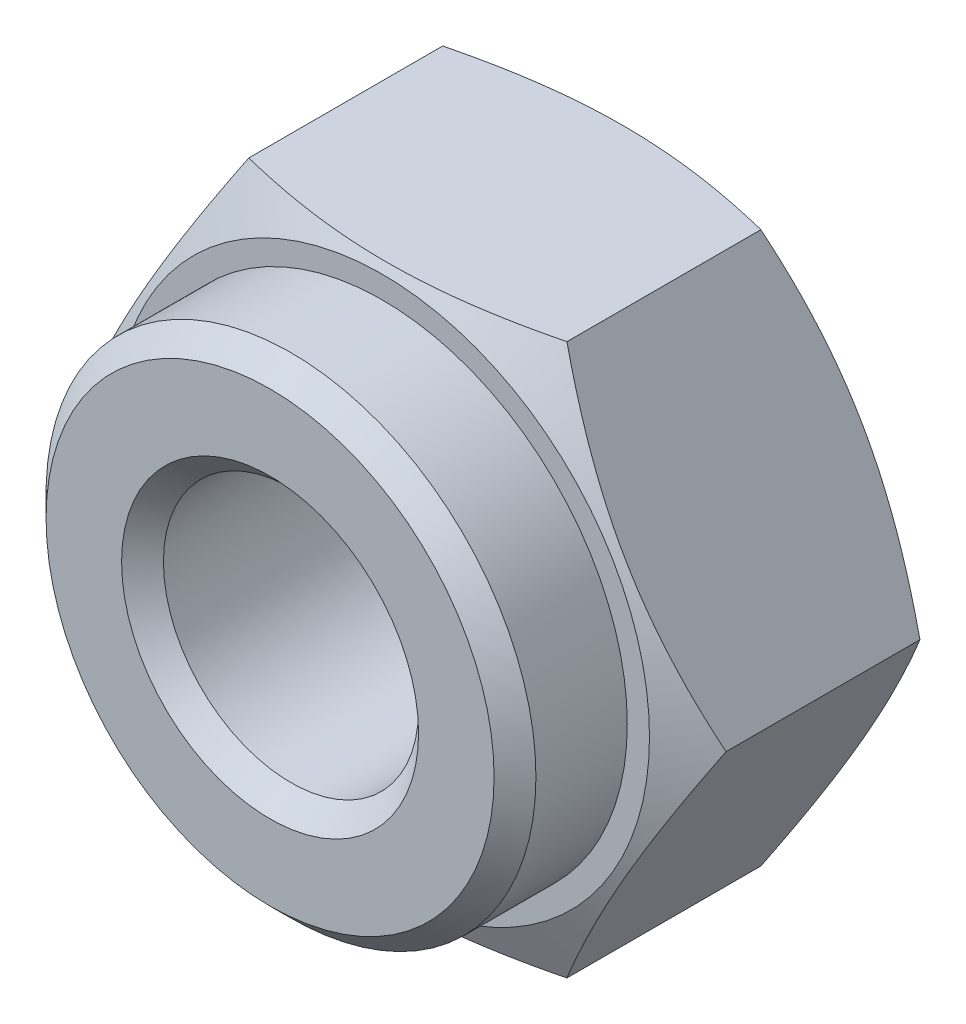
ISO-10303-21;
HEADER;
FILE_DESCRIPTION(('STEP AP214'),'2;1');
FILE_NAME('part.step','',(''),(''),'','','');
FILE_SCHEMA(('AUTOMOTIVE_DESIGN { 1 0 10303 214 1 1 1 1 }'));
ENDSEC;
DATA;
#1=APPLICATION_CONTEXT('core data for automotive mechanical design processes');
#2=APPLICATION_PROTOCOL_DEFINITION('international standard','automotive_design',2000,#1);
#3=PRODUCT_CONTEXT('',#1,'mechanical');
#4=PRODUCT('Part','Part','',(#3));
#5=PRODUCT_RELATED_PRODUCT_CATEGORY('part','',(#4));
#6=PRODUCT_DEFINITION_FORMATION('','',#4);
#7=PRODUCT_DEFINITION_CONTEXT('part definition',#1,'design');
#8=PRODUCT_DEFINITION('design','',#6,#7);
#9=PRODUCT_DEFINITION_SHAPE('','',#8);
#10=(LENGTH_UNIT() NAMED_UNIT(*) SI_UNIT(.MILLI.,.METRE.));
#11=(NAMED_UNIT(*) PLANE_ANGLE_UNIT() SI_UNIT($,.RADIAN.));
#12=(NAMED_UNIT(*) SI_UNIT($,.STERADIAN.) SOLID_ANGLE_UNIT());
#13=UNCERTAINTY_MEASURE_WITH_UNIT(LENGTH_MEASURE(1.E-05),#10,'distance_accuracy_value','');
#14=(GEOMETRIC_REPRESENTATION_CONTEXT(3) GLOBAL_UNCERTAINTY_ASSIGNED_CONTEXT((#13)) GLOBAL_UNIT_ASSIGNED_CONTEXT((#10,
#11,#12)) REPRESENTATION_CONTEXT('',''));
#15=CARTESIAN_POINT('',(0.,0.,0.));
#16=DIRECTION('',(0.,0.,1.));
#17=DIRECTION('',(1.,0.,0.));
#18=AXIS2_PLACEMENT_3D('',#15,#16,#17);
#19=CARTESIAN_POINT('',(0.,0.,2.4));
#20=DIRECTION('',(0.,0.,1.));
#21=DIRECTION('',(1.,0.,0.));
#22=AXIS2_PLACEMENT_3D('',#19,#20,#21);
#23=PLANE('',#22);
#24=CARTESIAN_POINT('',(0.,0.,2.39999999999996));
#25=DIRECTION('',(0.,0.,1.));
#26=DIRECTION('',(1.,0.,0.));
#27=AXIS2_PLACEMENT_3D('',#24,#25,#26);
#28=CIRCLE('',#27,2.61769145362398);
#29=CARTESIAN_POINT('',(2.61769145362398,0.,2.39999999999995));
#30=VERTEX_POINT('',#29);
#31=EDGE_CURVE('E212',#30,#30,#28,.T.);
#32=ORIENTED_EDGE('',*,*,#31,.T.);
#33=EDGE_LOOP('',(#32));
#34=FACE_BOUND('',#33,.T.);
#35=CARTESIAN_POINT('',(0.,0.,2.4));
#36=DIRECTION('',(0.,0.,1.));
#37=DIRECTION('',(1.,0.,0.));
#38=AXIS2_PLACEMENT_3D('',#35,#36,#37);
#39=CIRCLE('',#38,2.4);
#40=CARTESIAN_POINT('',(2.4,0.,2.4));
#41=VERTEX_POINT('',#40);
#42=EDGE_CURVE('E248',#41,#41,#39,.T.);
#43=ORIENTED_EDGE('',*,*,#42,.F.);
#44=EDGE_LOOP('',(#43));
#45=FACE_BOUND('',#44,.T.);
#46=ADVANCED_FACE('F17',(#34,#45),#23,.T.);
#47=CARTESIAN_POINT('',(0.,0.,0.));
#48=DIRECTION('',(0.,0.,1.));
#49=DIRECTION('',(1.,0.,0.));
#50=AXIS2_PLACEMENT_3D('',#47,#48,#49);
#51=PLANE('',#50);
#52=CARTESIAN_POINT('',(0.,0.,0.));
#53=DIRECTION('',(0.,0.,1.));
#54=DIRECTION('',(1.,0.,0.));
#55=AXIS2_PLACEMENT_3D('',#52,#53,#54);
#56=CIRCLE('',#55,1.455);
#57=CARTESIAN_POINT('',(1.455,0.,0.));
#58=VERTEX_POINT('',#57);
#59=EDGE_CURVE('E90',#58,#58,#56,.T.);
#60=ORIENTED_EDGE('',*,*,#59,.T.);
#61=EDGE_LOOP('',(#60));
#62=FACE_BOUND('',#61,.T.);
#63=CARTESIAN_POINT('',(0.,0.,0.));
#64=DIRECTION('',(0.,0.,1.));
#65=DIRECTION('',(1.,0.,0.));
#66=AXIS2_PLACEMENT_3D('',#63,#64,#65);
#67=CIRCLE('',#66,2.61769145362398);
#68=CARTESIAN_POINT('',(2.61769145362398,0.,0.));
#69=VERTEX_POINT('',#68);
#70=EDGE_CURVE('E76',#69,#69,#67,.T.);
#71=ORIENTED_EDGE('',*,*,#70,.F.);
#72=EDGE_LOOP('',(#71));
#73=FACE_BOUND('',#72,.T.);
#74=ADVANCED_FACE('F238',(#62,#73),#51,.F.);
#75=CARTESIAN_POINT('',(1.55884572681202,-2.7,2.4));
#76=DIRECTION('',(-0.866025403784442,0.5,0.));
#77=DIRECTION('',(-0.5,-0.866025403784442,0.));
#78=AXIS2_PLACEMENT_3D('',#75,#76,#77);
#79=PLANE('',#78);
#80=DIRECTION('',(0.,0.,-1.));
#81=VECTOR('',#80,1.);
#82=CARTESIAN_POINT('',(3.11769145362398,0.,2.4));
#83=LINE('',#82,#81);
#84=CARTESIAN_POINT('',(3.11769145362398,0.,2.14999999999998));
#85=VERTEX_POINT('',#84);
#86=CARTESIAN_POINT('',(3.11769145362398,0.,0.249999999999962));
#87=VERTEX_POINT('',#86);
#88=EDGE_CURVE('E85',#85,#87,#83,.T.);
#89=ORIENTED_EDGE('',*,*,#88,.F.);
#90=CARTESIAN_POINT('',(3.11780692367782,0.0002,2.14994226176567));
#91=CARTESIAN_POINT('',(3.07386192732842,-0.0759149664156107,2.17190865811727));
#92=CARTESIAN_POINT('',(3.02975666307042,-0.152307524991735,2.19257633708538));
#93=CARTESIAN_POINT('',(2.94119479165017,-0.305701185904994,2.23086925118443));
#94=CARTESIAN_POINT('',(2.89673801578346,-0.382702580446841,2.24849291937494));
#95=CARTESIAN_POINT('',(2.762759000059,-0.61476104282966,2.29613418161974));
#96=CARTESIAN_POINT('',(2.67272961448054,-0.770696512825772,2.32086913954805));
#97=CARTESIAN_POINT('',(2.53815325962149,-1.00378959693907,2.34482575675592));
#98=CARTESIAN_POINT('',(2.49388344587926,-1.08046716358222,2.35062594437673));
#99=CARTESIAN_POINT('',(2.4052569587881,-1.23397274212046,2.35790471774251));
#100=CARTESIAN_POINT('',(2.36090029805457,-1.31080073216503,2.35938389040537));
#101=CARTESIAN_POINT('',(2.27224935901895,-1.46434866271341,2.35795897875804));
#102=CARTESIAN_POINT('',(2.22795506231461,-1.54106863509086,2.35505921200905));
#103=CARTESIAN_POINT('',(2.13949248077105,-1.694290320893,2.34499790198758));
#104=CARTESIAN_POINT('',(2.09532418551242,-1.77079205236464,2.33783672200987));
#105=CARTESIAN_POINT('',(2.00996355172353,-1.91864100705328,2.32008684762));
#106=CARTESIAN_POINT('',(1.96875838024961,-1.99001045758072,2.30974141539699));
#107=CARTESIAN_POINT('',(1.88657953411541,-2.13234839439254,2.28582880871383));
#108=CARTESIAN_POINT('',(1.84560588467828,-2.20331683698917,2.2722612898974));
#109=CARTESIAN_POINT('',(1.76347074406329,-2.34557907362115,2.24207489271815));
#110=CARTESIAN_POINT('',(1.72231225533246,-2.41686766726569,2.225423667329));
#111=CARTESIAN_POINT('',(1.64029736310983,-2.55892162757258,2.18953475849402));
#112=CARTESIAN_POINT('',(1.59944082764135,-2.62968722282523,2.17029828536225));
#113=CARTESIAN_POINT('',(1.55873025675818,-2.7002,2.14994226176568));
#114=B_SPLINE_CURVE_WITH_KNOTS('',3,(#90,#91,#92,#93,#94,#95,#96,#97,#98,#99,#100,#101,#102,
#103,#104,#105,#106,#107,#108,#109,#110,#111,#112,#113),.UNSPECIFIED.,.F.,.F.,(4,2,2,2,2,2,2,2,
2,2,2,4),(0.,0.271754269824136,0.543648014133352,1.08806367663849,1.35416472324904,
1.62022962401707,1.88603236046234,2.15181243989058,2.40091555257944,2.65004529982691,
2.90195385117269,3.15374487675168),.UNSPECIFIED.);
#115=CARTESIAN_POINT('',(1.55884572681202,-2.7,2.15));
#116=VERTEX_POINT('',#115);
#117=EDGE_CURVE('E68',#85,#116,#114,.T.);
#118=ORIENTED_EDGE('',*,*,#117,.T.);
#119=DIRECTION('',(0.,0.,-1.));
#120=VECTOR('',#119,1.);
#121=CARTESIAN_POINT('',(1.55884572681202,-2.7,2.4));
#122=LINE('',#121,#120);
#123=CARTESIAN_POINT('',(1.55884572681202,-2.7,0.249999999999967));
#124=VERTEX_POINT('',#123);
#125=EDGE_CURVE('E37',#116,#124,#122,.T.);
#126=ORIENTED_EDGE('',*,*,#125,.T.);
#127=CARTESIAN_POINT('',(1.55873025675818,-2.7002,0.250057738234269));
#128=CARTESIAN_POINT('',(1.60267525310759,-2.62408503358439,0.228091341882681));
#129=CARTESIAN_POINT('',(1.6467805173656,-2.54769247500827,0.207423662914574));
#130=CARTESIAN_POINT('',(1.73534238878585,-2.39429881409501,0.169130748815527));
#131=CARTESIAN_POINT('',(1.77979916465256,-2.31729741955317,0.151507080625019));
#132=CARTESIAN_POINT('',(1.91377818037702,-2.08523895717034,0.103865818380212));
#133=CARTESIAN_POINT('',(2.00380756595548,-1.92930348717423,0.0791308604519053));
#134=CARTESIAN_POINT('',(2.13838392081453,-1.69621040306093,0.0551742432440379));
#135=CARTESIAN_POINT('',(2.18265373455677,-1.61953283641778,0.0493740556232284));
#136=CARTESIAN_POINT('',(2.27128022164793,-1.46602725787953,0.0420952822574424));
#137=CARTESIAN_POINT('',(2.31563688238146,-1.38919926783496,0.0406161095945838));
#138=CARTESIAN_POINT('',(2.40428782141707,-1.23565133728659,0.0420410212419241));
#139=CARTESIAN_POINT('',(2.44858211812142,-1.15893136490914,0.0449407879909141));
#140=CARTESIAN_POINT('',(2.53704469966497,-1.00570967910699,0.0550020980123714));
#141=CARTESIAN_POINT('',(2.58121299492358,-0.929207947635344,0.0621632779900707));
#142=CARTESIAN_POINT('',(2.66657362871247,-0.781358992946705,0.07991315237994));
#143=CARTESIAN_POINT('',(2.70777880018641,-0.709989542419274,0.0902585846029676));
#144=CARTESIAN_POINT('',(2.78995764632062,-0.567651605607467,0.114171191286137));
#145=CARTESIAN_POINT('',(2.83093129575775,-0.496683163010833,0.127738710102556));
#146=CARTESIAN_POINT('',(2.91306643637273,-0.354420926378858,0.157925107281808));
#147=CARTESIAN_POINT('',(2.95422492510356,-0.283132332734316,0.174576332670956));
#148=CARTESIAN_POINT('',(3.03623981732619,-0.141078372427429,0.210465241505937));
#149=CARTESIAN_POINT('',(3.07709635279467,-0.070312777174776,0.2297017146377));
#150=CARTESIAN_POINT('',(3.11780692367782,0.000200000000000712,0.250057738234255));
#151=B_SPLINE_CURVE_WITH_KNOTS('',3,(#127,#128,#129,#130,#131,#132,#133,#134,#135,#136,#137,
#138,#139,#140,#141,#142,#143,#144,#145,#146,#147,#148,#149,#150),.UNSPECIFIED.,.F.,.F.,(4,2,2,
2,2,2,2,2,2,2,2,4),(0.,0.271754269824135,0.543648014133352,1.08806367663849,1.35416472324905,
1.62022962401708,1.88603236046235,2.15181243989059,2.40091555257944,2.65004529982692,
2.90195385117269,3.15374487675168),.UNSPECIFIED.);
#152=EDGE_CURVE('E86',#124,#87,#151,.T.);
#153=ORIENTED_EDGE('',*,*,#152,.T.);
#154=EDGE_LOOP('',(#89,#118,#126,#153));
#155=FACE_BOUND('',#154,.T.);
#156=ADVANCED_FACE('F87',(#155),#79,.F.);
#157=CARTESIAN_POINT('',(3.11769145362398,0.,2.4));
#158=DIRECTION('',(-0.866025403784438,-0.5,0.));
#159=DIRECTION('',(0.5,-0.866025403784438,0.));
#160=AXIS2_PLACEMENT_3D('',#157,#158,#159);
#161=PLANE('',#160);
#162=DIRECTION('',(0.,0.,-1.));
#163=VECTOR('',#162,1.);
#164=CARTESIAN_POINT('',(1.55884572681199,2.7,2.4));
#165=LINE('',#164,#163);
#166=CARTESIAN_POINT('',(1.55884572681198,2.7,2.15));
#167=VERTEX_POINT('',#166);
#168=CARTESIAN_POINT('',(1.55884572681198,2.7,0.249999999999967));
#169=VERTEX_POINT('',#168);
#170=EDGE_CURVE('E81',#167,#169,#165,.T.);
#171=ORIENTED_EDGE('',*,*,#170,.F.);
#172=CARTESIAN_POINT('',(1.55873025675815,2.7002,2.14994226176567));
#173=CARTESIAN_POINT('',(1.60267525310756,2.6240850335844,2.17190865811728));
#174=CARTESIAN_POINT('',(1.64678051736557,2.54769247500828,2.19257633708539));
#175=CARTESIAN_POINT('',(1.73534238878582,2.39429881409502,2.23086925118444));
#176=CARTESIAN_POINT('',(1.77979916465253,2.31729741955317,2.24849291937495));
#177=CARTESIAN_POINT('',(1.91377818037698,2.08523895717035,2.29613418161975));
#178=CARTESIAN_POINT('',(2.00380756595545,1.92930348717424,2.32086913954806));
#179=CARTESIAN_POINT('',(2.1383839208145,1.69621040306095,2.34482575675593));
#180=CARTESIAN_POINT('',(2.18265373455673,1.61953283641779,2.35062594437674));
#181=CARTESIAN_POINT('',(2.2712802216479,1.46602725787955,2.35790471774253));
#182=CARTESIAN_POINT('',(2.31563688238142,1.38919926783498,2.35938389040538));
#183=CARTESIAN_POINT('',(2.40428782141704,1.2356513372866,2.35795897875805));
#184=CARTESIAN_POINT('',(2.44858211812138,1.15893136490915,2.35505921200906));
#185=CARTESIAN_POINT('',(2.53704469966494,1.00570967910701,2.34499790198759));
#186=CARTESIAN_POINT('',(2.58121299492356,0.929207947635369,2.33783672200987));
#187=CARTESIAN_POINT('',(2.66657362871245,0.781358992946726,2.32008684762));
#188=CARTESIAN_POINT('',(2.70777880018639,0.709989542419284,2.30974141539699));
#189=CARTESIAN_POINT('',(2.78995764632059,0.567651605607466,2.28582880871384));
#190=CARTESIAN_POINT('',(2.83093129575772,0.496683163010832,2.27226128989741));
#191=CARTESIAN_POINT('',(2.91306643637271,0.354420926378855,2.24207489271816));
#192=CARTESIAN_POINT('',(2.95422492510354,0.283132332734309,2.22542366732901));
#193=CARTESIAN_POINT('',(3.03623981732618,0.141078372427419,2.18953475849402));
#194=CARTESIAN_POINT('',(3.07709635279466,0.070312777174768,2.17029828536225));
#195=CARTESIAN_POINT('',(3.11780692367782,-0.000200000000000832,2.14994226176568));
#196=B_SPLINE_CURVE_WITH_KNOTS('',3,(#172,#173,#174,#175,#176,#177,#178,#179,#180,#181,#182,
#183,#184,#185,#186,#187,#188,#189,#190,#191,#192,#193,#194,#195),.UNSPECIFIED.,.F.,.F.,(4,2,2,
2,2,2,2,2,2,2,2,4),(0.,0.271754269824138,0.543648014133356,1.08806367663849,1.35416472324905,
1.62022962401708,1.88603236046234,2.15181243989059,2.40091555257945,2.65004529982693,
2.90195385117271,3.15374487675171),.UNSPECIFIED.);
#197=EDGE_CURVE('E71',#167,#85,#196,.T.);
#198=ORIENTED_EDGE('',*,*,#197,.T.);
#199=ORIENTED_EDGE('',*,*,#88,.T.);
#200=CARTESIAN_POINT('',(3.11780692367782,-0.000200000000000058,0.250057738234264));
#201=CARTESIAN_POINT('',(3.07386192732841,0.0759149664156044,0.228091341882671));
#202=CARTESIAN_POINT('',(3.0297566630704,0.152307524991726,0.207423662914563));
#203=CARTESIAN_POINT('',(2.94119479165015,0.305701185904983,0.169130748815514));
#204=CARTESIAN_POINT('',(2.89673801578344,0.38270258044683,0.151507080625007));
#205=CARTESIAN_POINT('',(2.76275900005899,0.614761042829652,0.103865818380201));
#206=CARTESIAN_POINT('',(2.67272961448052,0.770696512825765,0.079130860451894));
#207=CARTESIAN_POINT('',(2.53815325962147,1.00378959693906,0.0551742432440261));
#208=CARTESIAN_POINT('',(2.49388344587924,1.08046716358222,0.0493740556232164));
#209=CARTESIAN_POINT('',(2.40525695878807,1.23397274212046,0.0420952822574307));
#210=CARTESIAN_POINT('',(2.36090029805454,1.31080073216503,0.0406161095945726));
#211=CARTESIAN_POINT('',(2.27224935901893,1.4643486627134,0.0420410212419119));
#212=CARTESIAN_POINT('',(2.22795506231459,1.54106863509086,0.0449407879909004));
#213=CARTESIAN_POINT('',(2.13949248077103,1.694290320893,0.0550020980123615));
#214=CARTESIAN_POINT('',(2.0953241855124,1.77079205236464,0.0621632779900662));
#215=CARTESIAN_POINT('',(2.00996355172351,1.91864100705328,0.0799131523799355));
#216=CARTESIAN_POINT('',(1.96875838024958,1.99001045758072,0.0902585846029585));
#217=CARTESIAN_POINT('',(1.88657953411538,2.13234839439253,0.114171191286126));
#218=CARTESIAN_POINT('',(1.84560588467825,2.20331683698917,0.127738710102547));
#219=CARTESIAN_POINT('',(1.76347074406326,2.34557907362114,0.1579251072818));
#220=CARTESIAN_POINT('',(1.72231225533243,2.41686766726569,0.174576332670949));
#221=CARTESIAN_POINT('',(1.64029736310979,2.55892162757258,0.210465241505932));
#222=CARTESIAN_POINT('',(1.59944082764131,2.62968722282523,0.229701714637698));
#223=CARTESIAN_POINT('',(1.55873025675815,2.7002,0.250057738234261));
#224=B_SPLINE_CURVE_WITH_KNOTS('',3,(#200,#201,#202,#203,#204,#205,#206,#207,#208,#209,#210,
#211,#212,#213,#214,#215,#216,#217,#218,#219,#220,#221,#222,#223),.UNSPECIFIED.,.F.,.F.,(4,2,2,
2,2,2,2,2,2,2,2,4),(0.,0.271754269824135,0.543648014133351,1.08806367663849,1.35416472324905,
1.62022962401708,1.88603236046234,2.15181243989059,2.40091555257945,2.65004529982692,
2.9019538511727,3.1537448767517),.UNSPECIFIED.);
#225=EDGE_CURVE('E160',#87,#169,#224,.T.);
#226=ORIENTED_EDGE('',*,*,#225,.T.);
#227=EDGE_LOOP('',(#171,#198,#199,#226));
#228=FACE_BOUND('',#227,.T.);
#229=ADVANCED_FACE('F79',(#228),#161,.F.);
#230=CARTESIAN_POINT('',(1.55884572681199,2.7,2.4));
#231=DIRECTION('',(0.,-1.,0.));
#232=DIRECTION('',(1.,0.,0.));
#233=AXIS2_PLACEMENT_3D('',#230,#231,#232);
#234=PLANE('',#233);
#235=DIRECTION('',(0.,0.,-1.));
#236=VECTOR('',#235,1.);
#237=CARTESIAN_POINT('',(-1.55884572681201,2.7,2.4));
#238=LINE('',#237,#236);
#239=CARTESIAN_POINT('',(-1.55884572681724,2.69999999999696,2.15));
#240=VERTEX_POINT('',#239);
#241=CARTESIAN_POINT('',(-1.55884572681201,2.7,0.249999999999978));
#242=VERTEX_POINT('',#241);
#243=EDGE_CURVE('E94',#240,#242,#238,.T.);
#244=ORIENTED_EDGE('',*,*,#243,.F.);
#245=CARTESIAN_POINT('',(-4.12828289102211,2.7,1.24243539860706));
#246=CARTESIAN_POINT('',(-4.00732724114519,2.69999999999999,1.29303441690253));
#247=CARTESIAN_POINT('',(-3.8861409038152,2.69999999999998,1.34309225949658));
#248=CARTESIAN_POINT('',(-3.6431829369039,2.69999999999998,1.44181608154423));
#249=CARTESIAN_POINT('',(-3.52141122543085,2.69999999999998,1.4904818592183));
#250=CARTESIAN_POINT('',(-3.27670342912437,2.69999999999998,1.58628910187355));
#251=CARTESIAN_POINT('',(-3.15376463274119,2.69999999999998,1.63342366656078));
#252=CARTESIAN_POINT('',(-2.90707761737907,2.69999999999998,1.72551770911774));
#253=CARTESIAN_POINT('',(-2.7833294317055,2.69999999999998,1.77047727585463));
#254=CARTESIAN_POINT('',(-2.53654666094537,2.69999999999998,1.85705981979424));
#255=CARTESIAN_POINT('',(-2.4135251042946,2.69999999999999,1.89871973483008));
#256=CARTESIAN_POINT('',(-2.16636913516212,2.69999999999999,1.97865283330061));
#257=CARTESIAN_POINT('',(-2.04223464168484,2.69999999999999,2.01692576800307));
#258=CARTESIAN_POINT('',(-1.79286719736715,2.69999999999999,2.08911933928596));
#259=CARTESIAN_POINT('',(-1.6676358766652,2.69999999999999,2.12304554628887));
#260=CARTESIAN_POINT('',(-1.41583324929957,2.69999999999999,2.18547472158956));
#261=CARTESIAN_POINT('',(-1.2892621181469,2.7,2.21397839116489));
#262=CARTESIAN_POINT('',(-1.00081585564859,2.7,2.2709883891261));
#263=CARTESIAN_POINT('',(-0.838527600361433,2.69999999999999,2.2974681862904));
#264=CARTESIAN_POINT('',(-0.512315169069906,2.69999999999999,2.33702474455401));
#265=CARTESIAN_POINT('',(-0.348391722133296,2.69999999999999,2.35010723100745));
#266=CARTESIAN_POINT('',(-0.101832255665182,2.69999999999999,2.358517274401));
#267=CARTESIAN_POINT('',(-0.0193605587369631,2.69999999999999,2.35944180392818));
#268=CARTESIAN_POINT('',(0.145536057810723,2.69999999999999,2.35751270147999));
#269=CARTESIAN_POINT('',(0.227960980697344,2.7,2.35465937771338));
#270=CARTESIAN_POINT('',(0.392592116426803,2.7,2.3452624882261));
#271=CARTESIAN_POINT('',(0.474798344354044,2.7,2.33871918401879));
#272=CARTESIAN_POINT('',(0.638847547924247,2.7,2.32215312545944));
#273=CARTESIAN_POINT('',(0.720690541944865,2.7,2.31213054921982));
#274=CARTESIAN_POINT('',(1.03994602556655,2.7,2.26665467080715));
#275=CARTESIAN_POINT('',(1.27570103517605,2.7,2.21921036540281));
#276=CARTESIAN_POINT('',(1.62575341924958,2.7,2.13383568608714));
#277=CARTESIAN_POINT('',(1.7419374746478,2.7,2.10297733809174));
#278=CARTESIAN_POINT('',(1.97322559940511,2.7,2.03742725502598));
#279=CARTESIAN_POINT('',(2.08832975010576,2.7,2.00273581123177));
#280=CARTESIAN_POINT('',(2.31840760874049,2.7,1.93001182745925));
#281=CARTESIAN_POINT('',(2.43337396343627,2.7,1.89195633268818));
#282=CARTESIAN_POINT('',(2.66245074779036,2.7,1.81334271544357));
#283=CARTESIAN_POINT('',(2.77656113767818,2.70000000000001,1.77278447748361));
#284=CARTESIAN_POINT('',(3.117643559595,2.70000000000001,1.64817418722275));
#285=CARTESIAN_POINT('',(3.34352212703388,2.70000000000001,1.56113592132942));
#286=CARTESIAN_POINT('',(3.79561619736995,2.70000000000001,1.38086295237596));
#287=CARTESIAN_POINT('',(4.02180861385978,2.70000000000001,1.2875711220041));
#288=CARTESIAN_POINT('',(4.47268364533178,2.70000000000001,1.09731796241648));
#289=CARTESIAN_POINT('',(4.69736600440387,2.70000000000001,1.00035602881569));
#290=CARTESIAN_POINT('',(5.14181350612312,2.70000000000001,0.805529755584331));
#291=CARTESIAN_POINT('',(5.3615975679123,2.70000000000002,0.707708375971009));
#292=CARTESIAN_POINT('',(5.80027063110302,2.70000000000001,0.510239101219669));
#293=CARTESIAN_POINT('',(6.01915986595516,2.70000000000001,0.410591725333012));
#294=CARTESIAN_POINT('',(6.23776106872172,2.7,0.310329022775659));
#295=B_SPLINE_CURVE_WITH_KNOTS('',3,(#245,#246,#247,#248,#249,#250,#251,#252,#253,#254,#255,
#256,#257,#258,#259,#260,#261,#262,#263,#264,#265,#266,#267,#268,#269,#270,#271,#272,#273,#274,
#275,#276,#277,#278,#279,#280,#281,#282,#283,#284,#285,#286,#287,#288,#289,#290,#291,#292,#293,
#294),.UNSPECIFIED.,.F.,.F.,(4,2,2,2,2,2,2,2,2,2,2,2,2,2,2,2,2,2,2,2,2,2,2,2,4),(0.,
0.39334260410903,0.786741937161071,1.18171988008226,1.5766816711415,1.9662951352693,
2.35593718803066,2.74507480264597,3.1341620572091,3.62701391553686,4.11965506512514,
4.36701026261966,4.61434528136894,4.86166277338971,5.1089676064918,5.82897676273366,
6.18959103070098,6.55017791448682,6.91344977741073,7.27673841568266,8.00282602211916,
8.73681568574589,9.47092675168947,10.1926285205892,10.914128152452),.UNSPECIFIED.);
#296=EDGE_CURVE('E83',#240,#167,#295,.T.);
#297=ORIENTED_EDGE('',*,*,#296,.T.);
#298=ORIENTED_EDGE('',*,*,#170,.T.);
#299=CARTESIAN_POINT('',(-4.12828289102209,2.7,1.15756460139292));
#300=CARTESIAN_POINT('',(-4.00732724114517,2.69999999999999,1.10696558309746));
#301=CARTESIAN_POINT('',(-3.88614090381518,2.69999999999998,1.05690774050341));
#302=CARTESIAN_POINT('',(-3.64318293690388,2.69999999999998,0.958183918455766));
#303=CARTESIAN_POINT('',(-3.52141122543084,2.69999999999998,0.909518140781686));
#304=CARTESIAN_POINT('',(-3.27670342912435,2.69999999999998,0.813710898126436));
#305=CARTESIAN_POINT('',(-3.15376463274117,2.69999999999998,0.766576333439203));
#306=CARTESIAN_POINT('',(-2.90707761737906,2.69999999999998,0.674482290882245));
#307=CARTESIAN_POINT('',(-2.78332943170549,2.69999999999998,0.629522724145356));
#308=CARTESIAN_POINT('',(-2.53654666094535,2.69999999999998,0.542940180205745));
#309=CARTESIAN_POINT('',(-2.41352510429459,2.69999999999999,0.501280265169898));
#310=CARTESIAN_POINT('',(-2.1663691351621,2.69999999999999,0.42134716669937));
#311=CARTESIAN_POINT('',(-2.04223464168483,2.69999999999999,0.383074231996905));
#312=CARTESIAN_POINT('',(-1.79286719736714,2.69999999999999,0.310880660714015));
#313=CARTESIAN_POINT('',(-1.66763587666519,2.69999999999999,0.276954453711111));
#314=CARTESIAN_POINT('',(-1.41583324929956,2.69999999999999,0.214525278410417));
#315=CARTESIAN_POINT('',(-1.28926211814689,2.7,0.186021608835069));
#316=CARTESIAN_POINT('',(-1.00081585564859,2.7,0.129011610873861));
#317=CARTESIAN_POINT('',(-0.838527600361432,2.69999999999999,0.102531813709568));
#318=CARTESIAN_POINT('',(-0.512315169069905,2.69999999999999,0.0629752554459648));
#319=CARTESIAN_POINT('',(-0.348391722133296,2.69999999999999,0.0498927689925252));
#320=CARTESIAN_POINT('',(-0.101832255665183,2.69999999999999,0.041482725598973));
#321=CARTESIAN_POINT('',(-0.019360558736965,2.69999999999999,0.0405581960717917));
#322=CARTESIAN_POINT('',(0.145536057810721,2.69999999999999,0.0424872985199741));
#323=CARTESIAN_POINT('',(0.227960980697342,2.7,0.0453406222865867));
#324=CARTESIAN_POINT('',(0.3925921164268,2.7,0.0547375117738695));
#325=CARTESIAN_POINT('',(0.47479834435404,2.7,0.0612808159811762));
#326=CARTESIAN_POINT('',(0.638847547924242,2.7,0.0778468745405179));
#327=CARTESIAN_POINT('',(0.72069054194486,2.7,0.0878694507801365));
#328=CARTESIAN_POINT('',(1.03994602556654,2.7,0.133345329192789));
#329=CARTESIAN_POINT('',(1.27570103517604,2.7,0.180789634597145));
#330=CARTESIAN_POINT('',(1.62575341924957,2.7,0.266164313912818));
#331=CARTESIAN_POINT('',(1.74193747464779,2.7,0.297022661908213));
#332=CARTESIAN_POINT('',(1.9732255994051,2.7,0.362572744973974));
#333=CARTESIAN_POINT('',(2.08832975010575,2.7,0.397264188768186));
#334=CARTESIAN_POINT('',(2.31840760874048,2.7,0.469988172540699));
#335=CARTESIAN_POINT('',(2.43337396343626,2.7,0.508043667311776));
#336=CARTESIAN_POINT('',(2.66245074779035,2.7,0.586657284556382));
#337=CARTESIAN_POINT('',(2.77656113767817,2.70000000000001,0.627215522516343));
#338=CARTESIAN_POINT('',(3.11764355959499,2.70000000000001,0.751825812777202));
#339=CARTESIAN_POINT('',(3.34352212703387,2.70000000000001,0.838864078670528));
#340=CARTESIAN_POINT('',(3.79561619736995,2.70000000000001,1.01913704762399));
#341=CARTESIAN_POINT('',(4.02180861385978,2.70000000000001,1.11242887799584));
#342=CARTESIAN_POINT('',(4.47268364533178,2.70000000000001,1.30268203758346));
#343=CARTESIAN_POINT('',(4.69736600440387,2.70000000000001,1.39964397118425));
#344=CARTESIAN_POINT('',(5.14181350612312,2.70000000000001,1.59447024441561));
#345=CARTESIAN_POINT('',(5.36159756791229,2.70000000000002,1.69229162402893));
#346=CARTESIAN_POINT('',(5.80027063110302,2.70000000000001,1.88976089878026));
#347=CARTESIAN_POINT('',(6.01915986595516,2.70000000000001,1.98940827466691));
#348=CARTESIAN_POINT('',(6.23776106872172,2.7,2.08967097722426));
#349=B_SPLINE_CURVE_WITH_KNOTS('',3,(#299,#300,#301,#302,#303,#304,#305,#306,#307,#308,#309,
#310,#311,#312,#313,#314,#315,#316,#317,#318,#319,#320,#321,#322,#323,#324,#325,#326,#327,#328,
#329,#330,#331,#332,#333,#334,#335,#336,#337,#338,#339,#340,#341,#342,#343,#344,#345,#346,#347,
#348),.UNSPECIFIED.,.F.,.F.,(4,2,2,2,2,2,2,2,2,2,2,2,2,2,2,2,2,2,2,2,2,2,2,2,4),(0.,
0.393342604109029,0.786741937161068,1.18171988008225,1.5766816711415,1.9662951352693,
2.35593718803066,2.74507480264596,3.13416205720909,3.62701391553685,4.11965506512513,
4.36701026261965,4.61434528136893,4.86166277338969,5.10896760649178,5.82897676273364,
6.18959103070096,6.5501779144868,6.91344977741071,7.27673841568264,8.00282602211914,
8.73681568574588,9.47092675168945,10.1926285205892,10.914128152452),.UNSPECIFIED.);
#350=EDGE_CURVE('E147',#169,#242,#349,.F.);
#351=ORIENTED_EDGE('',*,*,#350,.T.);
#352=EDGE_LOOP('',(#244,#297,#298,#351));
#353=FACE_BOUND('',#352,.T.);
#354=ADVANCED_FACE('F171',(#353),#234,.F.);
#355=CARTESIAN_POINT('',(-1.55884572681201,2.7,2.4));
#356=DIRECTION('',(0.866025403784442,-0.5,0.));
#357=DIRECTION('',(0.5,0.866025403784442,0.));
#358=AXIS2_PLACEMENT_3D('',#355,#356,#357);
#359=PLANE('',#358);
#360=DIRECTION('',(0.,0.,-1.));
#361=VECTOR('',#360,1.);
#362=CARTESIAN_POINT('',(-3.11769145362398,0.,2.4));
#363=LINE('',#362,#361);
#364=CARTESIAN_POINT('',(-3.11769145362396,-6.08367523025066E-12,2.15));
#365=VERTEX_POINT('',#364);
#366=CARTESIAN_POINT('',(-3.11769145362398,0.,0.249999999999984));
#367=VERTEX_POINT('',#366);
#368=EDGE_CURVE('E208',#365,#367,#363,.T.);
#369=ORIENTED_EDGE('',*,*,#368,.F.);
#370=CARTESIAN_POINT('',(-3.11780692367782,-0.00020000000002177,2.14994226176569));
#371=CARTESIAN_POINT('',(-3.07386192732842,0.0759149664155889,2.17190865811729));
#372=CARTESIAN_POINT('',(-3.02975666307042,0.152307524991714,2.1925763370854));
#373=CARTESIAN_POINT('',(-2.94119479165017,0.305701185904974,2.23086925118445));
#374=CARTESIAN_POINT('',(-2.89673801578345,0.382702580446822,2.24849291937495));
#375=CARTESIAN_POINT('',(-2.762759000059,0.614761042829643,2.29613418161976));
#376=CARTESIAN_POINT('',(-2.67272961448053,0.770696512825757,2.32086913954806));
#377=CARTESIAN_POINT('',(-2.53815325962148,1.00378959693905,2.34482575675593));
#378=CARTESIAN_POINT('',(-2.49388344587925,1.08046716358221,2.35062594437674));
#379=CARTESIAN_POINT('',(-2.40525695878809,1.23397274212045,2.35790471774253));
#380=CARTESIAN_POINT('',(-2.36090029805456,1.31080073216502,2.35938389040539));
#381=CARTESIAN_POINT('',(-2.27224935901894,1.4643486627134,2.35795897875805));
#382=CARTESIAN_POINT('',(-2.2279550623146,1.54106863509085,2.35505921200906));
#383=CARTESIAN_POINT('',(-2.13949248077104,1.69429032089299,2.3449979019876));
#384=CARTESIAN_POINT('',(-2.09532418551241,1.77079205236463,2.33783672200988));
#385=CARTESIAN_POINT('',(-2.00996355172352,1.91864100705327,2.32008684762001));
#386=CARTESIAN_POINT('',(-1.96875838024959,1.99001045758072,2.309741415397));
#387=CARTESIAN_POINT('',(-1.8865795341154,2.13234839439253,2.28582880871384));
#388=CARTESIAN_POINT('',(-1.84560588467826,2.20331683698917,2.27226128989742));
#389=CARTESIAN_POINT('',(-1.76347074406327,2.34557907362114,2.24207489271816));
#390=CARTESIAN_POINT('',(-1.72231225533244,2.41686766726569,2.22542366732901));
#391=CARTESIAN_POINT('',(-1.64029736310981,2.55892162757258,2.18953475849403));
#392=CARTESIAN_POINT('',(-1.59944082764133,2.62968722282523,2.17029828536226));
#393=CARTESIAN_POINT('',(-1.55873025675816,2.7002,2.14994226176569));
#394=B_SPLINE_CURVE_WITH_KNOTS('',3,(#370,#371,#372,#373,#374,#375,#376,#377,#378,#379,#380,
#381,#382,#383,#384,#385,#386,#387,#388,#389,#390,#391,#392,#393),.UNSPECIFIED.,.F.,.F.,(4,2,2,
2,2,2,2,2,2,2,2,4),(0.,0.271754269824139,0.543648014133357,1.0880636766385,1.35416472324905,
1.62022962401709,1.88603236046235,2.1518124398906,2.40091555257946,2.65004529982694,
2.90195385117271,3.15374487675171),.UNSPECIFIED.);
#395=EDGE_CURVE('E213',#365,#240,#394,.T.);
#396=ORIENTED_EDGE('',*,*,#395,.T.);
#397=ORIENTED_EDGE('',*,*,#243,.T.);
#398=CARTESIAN_POINT('',(-1.55873025675816,2.7002,0.25005773823428));
#399=CARTESIAN_POINT('',(-1.60267525310757,2.6240850335844,0.22809134188269));
#400=CARTESIAN_POINT('',(-1.64678051736558,2.54769247500827,0.207423662914583));
#401=CARTESIAN_POINT('',(-1.73534238878583,2.39429881409502,0.169130748815536));
#402=CARTESIAN_POINT('',(-1.77979916465255,2.31729741955317,0.151507080625028));
#403=CARTESIAN_POINT('',(-1.913778180377,2.08523895717035,0.103865818380221));
#404=CARTESIAN_POINT('',(-2.00380756595546,1.92930348717423,0.0791308604519151));
#405=CARTESIAN_POINT('',(-2.13838392081452,1.69621040306094,0.0551742432440477));
#406=CARTESIAN_POINT('',(-2.18265373455675,1.61953283641778,0.0493740556232381));
#407=CARTESIAN_POINT('',(-2.27128022164791,1.46602725787954,0.042095282257452));
#408=CARTESIAN_POINT('',(-2.31563688238144,1.38919926783497,0.0406161095945936));
#409=CARTESIAN_POINT('',(-2.40428782141706,1.2356513372866,0.0420410212419339));
#410=CARTESIAN_POINT('',(-2.4485821181214,1.15893136490915,0.0449407879909237));
#411=CARTESIAN_POINT('',(-2.53704469966495,1.005709679107,0.055002098012382));
#412=CARTESIAN_POINT('',(-2.58121299492356,0.929207947635353,0.0621632779900823));
#413=CARTESIAN_POINT('',(-2.66657362871245,0.781358992946712,0.0799131523799522));
#414=CARTESIAN_POINT('',(-2.7077788001864,0.709989542419278,0.0902585846029796));
#415=CARTESIAN_POINT('',(-2.7899576463206,0.567651605607465,0.11417119128615));
#416=CARTESIAN_POINT('',(-2.83093129575773,0.496683163010828,0.12773871010257));
#417=CARTESIAN_POINT('',(-2.91306643637272,0.354420926378848,0.157925107281823));
#418=CARTESIAN_POINT('',(-2.95422492510355,0.283132332734303,0.174576332670973));
#419=CARTESIAN_POINT('',(-3.03623981732619,0.141078372427411,0.210465241505956));
#420=CARTESIAN_POINT('',(-3.07709635279467,0.070312777174756,0.229701714637721));
#421=CARTESIAN_POINT('',(-3.11780692367782,-0.000200000000022539,0.250057738234278));
#422=B_SPLINE_CURVE_WITH_KNOTS('',3,(#398,#399,#400,#401,#402,#403,#404,#405,#406,#407,#408,
#409,#410,#411,#412,#413,#414,#415,#416,#417,#418,#419,#420,#421),.UNSPECIFIED.,.F.,.F.,(4,2,2,
2,2,2,2,2,2,2,2,4),(0.,0.271754269824134,0.54364801413335,1.08806367663849,1.35416472324905,
1.62022962401708,1.88603236046234,2.15181243989059,2.40091555257945,2.65004529982693,
2.90195385117271,3.15374487675171),.UNSPECIFIED.);
#423=EDGE_CURVE('E141',#242,#367,#422,.T.);
#424=ORIENTED_EDGE('',*,*,#423,.T.);
#425=EDGE_LOOP('',(#369,#396,#397,#424));
#426=FACE_BOUND('',#425,.T.);
#427=ADVANCED_FACE('F215',(#426),#359,.F.);
#428=CARTESIAN_POINT('',(-3.11769145362398,0.,2.4));
#429=DIRECTION('',(0.866025403784435,0.500000000000007,0.));
#430=DIRECTION('',(-0.500000000000007,0.866025403784435,0.));
#431=AXIS2_PLACEMENT_3D('',#428,#429,#430);
#432=PLANE('',#431);
#433=DIRECTION('',(0.,0.,-1.));
#434=VECTOR('',#433,1.);
#435=CARTESIAN_POINT('',(-1.55884572681197,-2.7,2.4));
#436=LINE('',#435,#434);
#437=CARTESIAN_POINT('',(-1.55884572681197,-2.7,2.15));
#438=VERTEX_POINT('',#437);
#439=CARTESIAN_POINT('',(-1.55884572681197,-2.7,0.249999999999978));
#440=VERTEX_POINT('',#439);
#441=EDGE_CURVE('E210',#438,#440,#436,.T.);
#442=ORIENTED_EDGE('',*,*,#441,.F.);
#443=CARTESIAN_POINT('',(-1.55873025675813,-2.7002,2.14994226176568));
#444=CARTESIAN_POINT('',(-1.60267525310754,-2.6240850335844,2.17190865811729));
#445=CARTESIAN_POINT('',(-1.64678051736555,-2.54769247500828,2.1925763370854));
#446=CARTESIAN_POINT('',(-1.73534238878581,-2.39429881409502,2.23086925118445));
#447=CARTESIAN_POINT('',(-1.77979916465252,-2.31729741955317,2.24849291937496));
#448=CARTESIAN_POINT('',(-1.91377818037697,-2.08523895717036,2.29613418161976));
#449=CARTESIAN_POINT('',(-2.00380756595544,-1.92930348717424,2.32086913954807));
#450=CARTESIAN_POINT('',(-2.13838392081449,-1.69621040306095,2.34482575675594));
#451=CARTESIAN_POINT('',(-2.18265373455672,-1.6195328364178,2.35062594437675));
#452=CARTESIAN_POINT('',(-2.27128022164789,-1.46602725787955,2.35790471774254));
#453=CARTESIAN_POINT('',(-2.31563688238142,-1.38919926783499,2.35938389040539));
#454=CARTESIAN_POINT('',(-2.40428782141703,-1.23565133728661,2.35795897875806));
#455=CARTESIAN_POINT('',(-2.44858211812138,-1.15893136490916,2.35505921200907));
#456=CARTESIAN_POINT('',(-2.53704469966493,-1.00570967910702,2.3449979019876));
#457=CARTESIAN_POINT('',(-2.58121299492356,-0.929207947635381,2.33783672200988));
#458=CARTESIAN_POINT('',(-2.66657362871245,-0.781358992946739,2.32008684762001));
#459=CARTESIAN_POINT('',(-2.70777880018638,-0.709989542419299,2.309741415397));
#460=CARTESIAN_POINT('',(-2.78995764632058,-0.567651605607483,2.28582880871385));
#461=CARTESIAN_POINT('',(-2.83093129575772,-0.49668316301085,2.27226128989742));
#462=CARTESIAN_POINT('',(-2.91306643637271,-0.354420926378873,2.24207489271817));
#463=CARTESIAN_POINT('',(-2.95422492510354,-0.283132332734328,2.22542366732902));
#464=CARTESIAN_POINT('',(-3.03623981732617,-0.14107837242744,2.18953475849404));
#465=CARTESIAN_POINT('',(-3.07709635279466,-0.0703127771747892,2.17029828536227));
#466=CARTESIAN_POINT('',(-3.11780692367782,0.000199999999978765,2.14994226176569));
#467=B_SPLINE_CURVE_WITH_KNOTS('',3,(#443,#444,#445,#446,#447,#448,#449,#450,#451,#452,#453,
#454,#455,#456,#457,#458,#459,#460,#461,#462,#463,#464,#465,#466),.UNSPECIFIED.,.F.,.F.,(4,2,2,
2,2,2,2,2,2,2,2,4),(0.,0.271754269824137,0.543648014133354,1.08806367663849,1.35416472324904,
1.62022962401708,1.88603236046234,2.15181243989059,2.40091555257944,2.65004529982692,
2.9019538511727,3.1537448767517),.UNSPECIFIED.);
#468=EDGE_CURVE('E32',#438,#365,#467,.T.);
#469=ORIENTED_EDGE('',*,*,#468,.T.);
#470=ORIENTED_EDGE('',*,*,#368,.T.);
#471=CARTESIAN_POINT('',(-3.11780692367782,0.000199999999978286,0.250057738234286));
#472=CARTESIAN_POINT('',(-3.07386192732841,-0.0759149664156258,0.228091341882694));
#473=CARTESIAN_POINT('',(-3.0297566630704,-0.152307524991747,0.207423662914585));
#474=CARTESIAN_POINT('',(-2.94119479165015,-0.305701185905003,0.169130748815536));
#475=CARTESIAN_POINT('',(-2.89673801578344,-0.38270258044685,0.151507080625028));
#476=CARTESIAN_POINT('',(-2.76275900005898,-0.614761042829669,0.10386581838022));
#477=CARTESIAN_POINT('',(-2.67272961448051,-0.770696512825781,0.0791308604519134));
#478=CARTESIAN_POINT('',(-2.53815325962146,-1.00378959693907,0.0551742432440441));
#479=CARTESIAN_POINT('',(-2.49388344587923,-1.08046716358223,0.0493740556232338));
#480=CARTESIAN_POINT('',(-2.40525695878806,-1.23397274212047,0.042095282257447));
#481=CARTESIAN_POINT('',(-2.36090029805453,-1.31080073216504,0.0406161095945886));
#482=CARTESIAN_POINT('',(-2.27224935901892,-1.46434866271341,0.0420410212419269));
#483=CARTESIAN_POINT('',(-2.22795506231458,-1.54106863509087,0.0449407879909148));
#484=CARTESIAN_POINT('',(-2.13949248077102,-1.69429032089301,0.0550020980123758));
#485=CARTESIAN_POINT('',(-2.09532418551239,-1.77079205236465,0.0621632779900809));
#486=CARTESIAN_POINT('',(-2.0099635517235,-1.91864100705329,0.0799131523799495));
#487=CARTESIAN_POINT('',(-1.96875838024957,-1.99001045758073,0.0902585846029716));
#488=CARTESIAN_POINT('',(-1.88657953411537,-2.13234839439254,0.114171191286137));
#489=CARTESIAN_POINT('',(-1.84560588467823,-2.20331683698917,0.127738710102559));
#490=CARTESIAN_POINT('',(-1.76347074406324,-2.34557907362115,0.157925107281811));
#491=CARTESIAN_POINT('',(-1.72231225533242,-2.4168676672657,0.174576332670959));
#492=CARTESIAN_POINT('',(-1.64029736310978,-2.55892162757258,0.210465241505942));
#493=CARTESIAN_POINT('',(-1.59944082764129,-2.62968722282523,0.229701714637708));
#494=CARTESIAN_POINT('',(-1.55873025675812,-2.7002,0.250057738234272));
#495=B_SPLINE_CURVE_WITH_KNOTS('',3,(#471,#472,#473,#474,#475,#476,#477,#478,#479,#480,#481,
#482,#483,#484,#485,#486,#487,#488,#489,#490,#491,#492,#493,#494),.UNSPECIFIED.,.F.,.F.,(4,2,2,
2,2,2,2,2,2,2,2,4),(0.,0.271754269824135,0.543648014133351,1.08806367663849,1.35416472324905,
1.62022962401708,1.88603236046234,2.15181243989058,2.40091555257944,2.65004529982692,
2.90195385117269,3.15374487675169),.UNSPECIFIED.);
#496=EDGE_CURVE('E134',#367,#440,#495,.T.);
#497=ORIENTED_EDGE('',*,*,#496,.T.);
#498=EDGE_LOOP('',(#442,#469,#470,#497));
#499=FACE_BOUND('',#498,.T.);
#500=ADVANCED_FACE('F227',(#499),#432,.F.);
#501=CARTESIAN_POINT('',(-1.55884572681197,-2.7,2.4));
#502=DIRECTION('',(0.,1.,0.));
#503=DIRECTION('',(-1.,0.,0.));
#504=AXIS2_PLACEMENT_3D('',#501,#502,#503);
#505=PLANE('',#504);
#506=ORIENTED_EDGE('',*,*,#125,.F.);
#507=CARTESIAN_POINT('',(-4.12828289102207,-2.70000000000005,1.24243539860706));
#508=CARTESIAN_POINT('',(-4.00732724114515,-2.70000000000003,1.29303441690253));
#509=CARTESIAN_POINT('',(-3.88614090381516,-2.70000000000003,1.34309225949659));
#510=CARTESIAN_POINT('',(-3.64318293690386,-2.70000000000002,1.44181608154423));
#511=CARTESIAN_POINT('',(-3.52141122543081,-2.70000000000002,1.49048185921831));
#512=CARTESIAN_POINT('',(-3.27670342912433,-2.70000000000002,1.58628910187356));
#513=CARTESIAN_POINT('',(-3.15376463274115,-2.70000000000002,1.63342366656079));
#514=CARTESIAN_POINT('',(-2.90707761737904,-2.70000000000001,1.72551770911774));
#515=CARTESIAN_POINT('',(-2.78332943170546,-2.70000000000001,1.77047727585463));
#516=CARTESIAN_POINT('',(-2.53654666094533,-2.70000000000001,1.85705981979424));
#517=CARTESIAN_POINT('',(-2.41352510429456,-2.70000000000001,1.89871973483009));
#518=CARTESIAN_POINT('',(-2.16636913516208,-2.70000000000001,1.97865283330061));
#519=CARTESIAN_POINT('',(-2.0422346416848,-2.70000000000001,2.01692576800308));
#520=CARTESIAN_POINT('',(-1.79286719736712,-2.7,2.08911933928597));
#521=CARTESIAN_POINT('',(-1.66763587666517,-2.7,2.12304554628888));
#522=CARTESIAN_POINT('',(-1.41583324929954,-2.7,2.18547472158956));
#523=CARTESIAN_POINT('',(-1.28926211814686,-2.7,2.21397839116489));
#524=CARTESIAN_POINT('',(-1.00081585564855,-2.7,2.2709883891261));
#525=CARTESIAN_POINT('',(-0.838527600361398,-2.69999999999999,2.29746818629041));
#526=CARTESIAN_POINT('',(-0.512315169069871,-2.69999999999999,2.33702474455402));
#527=CARTESIAN_POINT('',(-0.34839172213326,-2.69999999999999,2.35010723100745));
#528=CARTESIAN_POINT('',(-0.101832255665146,-2.69999999999999,2.358517274401));
#529=CARTESIAN_POINT('',(-0.0193605587369268,-2.69999999999998,2.35944180392818));
#530=CARTESIAN_POINT('',(0.14553605781076,-2.69999999999998,2.35751270148));
#531=CARTESIAN_POINT('',(0.227960980697381,-2.69999999999998,2.35465937771339));
#532=CARTESIAN_POINT('',(0.392592116426841,-2.69999999999998,2.3452624882261));
#533=CARTESIAN_POINT('',(0.474798344354082,-2.69999999999997,2.3387191840188));
#534=CARTESIAN_POINT('',(0.638847547924285,-2.69999999999998,2.32215312545945));
#535=CARTESIAN_POINT('',(0.720690541944903,-2.69999999999999,2.31213054921982));
#536=CARTESIAN_POINT('',(1.03994602556659,-2.70000000000002,2.26665467080714));
#537=CARTESIAN_POINT('',(1.27570103517609,-2.69999999999998,2.21921036540281));
#538=CARTESIAN_POINT('',(1.62575341924962,-2.69999999999996,2.13383568608715));
#539=CARTESIAN_POINT('',(1.74193747464784,-2.69999999999996,2.10297733809175));
#540=CARTESIAN_POINT('',(1.97322559940515,-2.69999999999996,2.03742725502598));
#541=CARTESIAN_POINT('',(2.0883297501058,-2.69999999999996,2.00273581123177));
#542=CARTESIAN_POINT('',(2.31840760874053,-2.69999999999996,1.93001182745926));
#543=CARTESIAN_POINT('',(2.43337396343631,-2.69999999999996,1.89195633268818));
#544=CARTESIAN_POINT('',(2.6624507477904,-2.69999999999996,1.81334271544357));
#545=CARTESIAN_POINT('',(2.77656113767822,-2.69999999999995,1.77278447748361));
#546=CARTESIAN_POINT('',(3.11764355959504,-2.69999999999995,1.64817418722275));
#547=CARTESIAN_POINT('',(3.34352212703392,-2.69999999999995,1.56113592132942));
#548=CARTESIAN_POINT('',(3.79561619736999,-2.69999999999994,1.38086295237596));
#549=CARTESIAN_POINT('',(4.02180861385982,-2.69999999999994,1.28757112200411));
#550=CARTESIAN_POINT('',(4.47268364533181,-2.69999999999994,1.09731796241649));
#551=CARTESIAN_POINT('',(4.69736600440391,-2.69999999999993,1.0003560288157));
#552=CARTESIAN_POINT('',(5.14181350612315,-2.69999999999993,0.805529755584336));
#553=CARTESIAN_POINT('',(5.36159756791233,-2.69999999999993,0.707708375971014));
#554=CARTESIAN_POINT('',(5.80027063110305,-2.69999999999992,0.510239101219674));
#555=CARTESIAN_POINT('',(6.01915986595519,-2.69999999999993,0.410591725333015));
#556=CARTESIAN_POINT('',(6.23776106872175,-2.69999999999993,0.31032902277566));
#557=B_SPLINE_CURVE_WITH_KNOTS('',3,(#507,#508,#509,#510,#511,#512,#513,#514,#515,#516,#517,
#518,#519,#520,#521,#522,#523,#524,#525,#526,#527,#528,#529,#530,#531,#532,#533,#534,#535,#536,
#537,#538,#539,#540,#541,#542,#543,#544,#545,#546,#547,#548,#549,#550,#551,#552,#553,#554,#555,
#556),.UNSPECIFIED.,.F.,.F.,(4,2,2,2,2,2,2,2,2,2,2,2,2,2,2,2,2,2,2,2,2,2,2,2,4),(0.,
0.39334260410903,0.786741937161071,1.18171988008226,1.5766816711415,1.9662951352693,
2.35593718803066,2.74507480264597,3.13416205720909,3.62701391553686,4.11965506512514,
4.36701026261966,4.61434528136894,4.86166277338971,5.1089676064918,5.82897676273367,
6.18959103070098,6.55017791448682,6.91344977741073,7.27673841568266,8.00282602211916,
8.73681568574589,9.47092675168946,10.1926285205892,10.914128152452),.UNSPECIFIED.);
#558=EDGE_CURVE('E72',#116,#438,#557,.F.);
#559=ORIENTED_EDGE('',*,*,#558,.T.);
#560=ORIENTED_EDGE('',*,*,#441,.T.);
#561=CARTESIAN_POINT('',(-4.12828289102205,-2.70000000000005,1.15756460139292));
#562=CARTESIAN_POINT('',(-4.00732724114513,-2.70000000000003,1.10696558309746));
#563=CARTESIAN_POINT('',(-3.88614090381514,-2.70000000000003,1.05690774050341));
#564=CARTESIAN_POINT('',(-3.64318293690384,-2.70000000000002,0.958183918455763));
#565=CARTESIAN_POINT('',(-3.5214112254308,-2.70000000000002,0.909518140781683));
#566=CARTESIAN_POINT('',(-3.27670342912431,-2.70000000000002,0.813710898126433));
#567=CARTESIAN_POINT('',(-3.15376463274113,-2.70000000000002,0.766576333439199));
#568=CARTESIAN_POINT('',(-2.90707761737902,-2.70000000000001,0.674482290882241));
#569=CARTESIAN_POINT('',(-2.78332943170545,-2.70000000000001,0.629522724145352));
#570=CARTESIAN_POINT('',(-2.53654666094532,-2.70000000000001,0.542940180205741));
#571=CARTESIAN_POINT('',(-2.41352510429455,-2.70000000000001,0.501280265169894));
#572=CARTESIAN_POINT('',(-2.16636913516207,-2.70000000000001,0.421347166699366));
#573=CARTESIAN_POINT('',(-2.04223464168479,-2.70000000000001,0.383074231996902));
#574=CARTESIAN_POINT('',(-1.79286719736711,-2.7,0.310880660714011));
#575=CARTESIAN_POINT('',(-1.66763587666516,-2.7,0.276954453711106));
#576=CARTESIAN_POINT('',(-1.41583324929953,-2.7,0.214525278410413));
#577=CARTESIAN_POINT('',(-1.28926211814686,-2.7,0.186021608835069));
#578=CARTESIAN_POINT('',(-1.00081585564855,-2.7,0.129011610873861));
#579=CARTESIAN_POINT('',(-0.838527600361394,-2.69999999999999,0.102531813709564));
#580=CARTESIAN_POINT('',(-0.512315169069868,-2.69999999999999,0.0629752554459586));
#581=CARTESIAN_POINT('',(-0.348391722133259,-2.69999999999999,0.0498927689925197));
#582=CARTESIAN_POINT('',(-0.101832255665146,-2.69999999999999,0.0414827255989679));
#583=CARTESIAN_POINT('',(-0.0193605587369278,-2.69999999999998,0.0405581960717866));
#584=CARTESIAN_POINT('',(0.145536057810758,-2.69999999999998,0.0424872985199691));
#585=CARTESIAN_POINT('',(0.227960980697379,-2.69999999999998,0.0453406222865818));
#586=CARTESIAN_POINT('',(0.392592116426837,-2.69999999999998,0.054737511773864));
#587=CARTESIAN_POINT('',(0.474798344354077,-2.69999999999997,0.0612808159811699));
#588=CARTESIAN_POINT('',(0.638847547924279,-2.69999999999998,0.0778468745405135));
#589=CARTESIAN_POINT('',(0.720690541944897,-2.69999999999999,0.0878694507801348));
#590=CARTESIAN_POINT('',(1.03994602556658,-2.70000000000002,0.133345329192793));
#591=CARTESIAN_POINT('',(1.27570103517608,-2.69999999999998,0.180789634597142));
#592=CARTESIAN_POINT('',(1.62575341924961,-2.69999999999996,0.266164313912813));
#593=CARTESIAN_POINT('',(1.74193747464783,-2.69999999999996,0.297022661908209));
#594=CARTESIAN_POINT('',(1.97322559940514,-2.69999999999996,0.362572744973971));
#595=CARTESIAN_POINT('',(2.08832975010579,-2.69999999999996,0.397264188768183));
#596=CARTESIAN_POINT('',(2.31840760874052,-2.69999999999996,0.469988172540696));
#597=CARTESIAN_POINT('',(2.4333739634363,-2.69999999999996,0.508043667311773));
#598=CARTESIAN_POINT('',(2.66245074779039,-2.69999999999996,0.58665728455638));
#599=CARTESIAN_POINT('',(2.77656113767821,-2.69999999999995,0.62721552251634));
#600=CARTESIAN_POINT('',(3.11764355959504,-2.69999999999995,0.7518258127772));
#601=CARTESIAN_POINT('',(3.34352212703392,-2.69999999999995,0.838864078670526));
#602=CARTESIAN_POINT('',(3.79561619736999,-2.69999999999994,1.01913704762399));
#603=CARTESIAN_POINT('',(4.02180861385982,-2.69999999999994,1.11242887799584));
#604=CARTESIAN_POINT('',(4.47268364533182,-2.69999999999994,1.30268203758346));
#605=CARTESIAN_POINT('',(4.69736600440391,-2.69999999999993,1.39964397118425));
#606=CARTESIAN_POINT('',(5.14181350612316,-2.69999999999993,1.5944702444156));
#607=CARTESIAN_POINT('',(5.36159756791233,-2.69999999999993,1.69229162402893));
#608=CARTESIAN_POINT('',(5.80027063110306,-2.69999999999992,1.88976089878026));
#609=CARTESIAN_POINT('',(6.0191598659552,-2.69999999999993,1.98940827466691));
#610=CARTESIAN_POINT('',(6.23776106872176,-2.69999999999993,2.08967097722426));
#611=B_SPLINE_CURVE_WITH_KNOTS('',3,(#561,#562,#563,#564,#565,#566,#567,#568,#569,#570,#571,
#572,#573,#574,#575,#576,#577,#578,#579,#580,#581,#582,#583,#584,#585,#586,#587,#588,#589,#590,
#591,#592,#593,#594,#595,#596,#597,#598,#599,#600,#601,#602,#603,#604,#605,#606,#607,#608,#609,
#610),.UNSPECIFIED.,.F.,.F.,(4,2,2,2,2,2,2,2,2,2,2,2,2,2,2,2,2,2,2,2,2,2,2,2,4),(0.,
0.393342604109029,0.786741937161068,1.18171988008225,1.5766816711415,1.9662951352693,
2.35593718803066,2.74507480264596,3.13416205720909,3.62701391553685,4.11965506512513,
4.36701026261964,4.61434528136893,4.86166277338969,5.10896760649178,5.82897676273364,
6.18959103070095,6.55017791448679,6.91344977741071,7.27673841568264,8.00282602211914,
8.73681568574587,9.47092675168944,10.1926285205892,10.914128152452),.UNSPECIFIED.);
#612=EDGE_CURVE('E99',#440,#124,#611,.T.);
#613=ORIENTED_EDGE('',*,*,#612,.T.);
#614=EDGE_LOOP('',(#506,#559,#560,#613));
#615=FACE_BOUND('',#614,.T.);
#616=ADVANCED_FACE('F113',(#615),#505,.F.);
#617=CARTESIAN_POINT('',(0.,0.,2.4));
#618=DIRECTION('',(0.,0.,-1.));
#619=DIRECTION('',(-1.,0.,0.));
#620=AXIS2_PLACEMENT_3D('',#617,#618,#619);
#621=CYLINDRICAL_SURFACE('',#620,1.25);
#622=CARTESIAN_POINT('',(0.,0.,3.295));
#623=DIRECTION('',(0.,0.,1.));
#624=DIRECTION('',(1.,0.,0.));
#625=AXIS2_PLACEMENT_3D('',#622,#623,#624);
#626=CIRCLE('',#625,1.25);
#627=CARTESIAN_POINT('',(1.25,0.,3.295));
#628=VERTEX_POINT('',#627);
#629=EDGE_CURVE('E273',#628,#628,#626,.T.);
#630=ORIENTED_EDGE('',*,*,#629,.T.);
#631=EDGE_LOOP('',(#630));
#632=FACE_BOUND('',#631,.T.);
#633=CARTESIAN_POINT('',(0.,0.,0.205));
#634=DIRECTION('',(0.,0.,1.));
#635=DIRECTION('',(1.,0.,0.));
#636=AXIS2_PLACEMENT_3D('',#633,#634,#635);
#637=CIRCLE('',#636,1.25);
#638=CARTESIAN_POINT('',(1.25,0.,0.205));
#639=VERTEX_POINT('',#638);
#640=EDGE_CURVE('E95',#639,#639,#637,.F.);
#641=ORIENTED_EDGE('',*,*,#640,.T.);
#642=EDGE_LOOP('',(#641));
#643=FACE_BOUND('',#642,.T.);
#644=ADVANCED_FACE('F126',(#632,#643),#621,.F.);
#645=CARTESIAN_POINT('',(0.,0.,0.));
#646=DIRECTION('',(0.,0.,-1.));
#647=DIRECTION('',(-1.,0.,0.));
#648=AXIS2_PLACEMENT_3D('',#645,#646,#647);
#649=CONICAL_SURFACE('',#648,1.455,0.785398163397443);
#650=ORIENTED_EDGE('',*,*,#640,.F.);
#651=EDGE_LOOP('',(#650));
#652=FACE_BOUND('',#651,.T.);
#653=ORIENTED_EDGE('',*,*,#59,.F.);
#654=EDGE_LOOP('',(#653));
#655=FACE_BOUND('',#654,.T.);
#656=ADVANCED_FACE('F125',(#652,#655),#649,.F.);
#657=CARTESIAN_POINT('',(0.,0.,0.));
#658=DIRECTION('',(0.,0.,1.));
#659=DIRECTION('',(1.,0.,0.));
#660=AXIS2_PLACEMENT_3D('',#657,#658,#659);
#661=CONICAL_SURFACE('',#660,2.61769145362398,1.10714871779413);
#662=ORIENTED_EDGE('',*,*,#70,.T.);
#663=EDGE_LOOP('',(#662));
#664=FACE_BOUND('',#663,.T.);
#665=ORIENTED_EDGE('',*,*,#612,.F.);
#666=ORIENTED_EDGE('',*,*,#496,.F.);
#667=ORIENTED_EDGE('',*,*,#423,.F.);
#668=ORIENTED_EDGE('',*,*,#350,.F.);
#669=ORIENTED_EDGE('',*,*,#225,.F.);
#670=ORIENTED_EDGE('',*,*,#152,.F.);
#671=EDGE_LOOP('',(#665,#666,#667,#668,#669,#670));
#672=FACE_BOUND('',#671,.T.);
#673=ADVANCED_FACE('F118',(#664,#672),#661,.T.);
#674=CARTESIAN_POINT('',(0.,0.,2.15));
#675=DIRECTION('',(0.,0.,-1.));
#676=DIRECTION('',(-1.,0.,0.));
#677=AXIS2_PLACEMENT_3D('',#674,#675,#676);
#678=CONICAL_SURFACE('',#677,3.11769145362398,1.10714871779414);
#679=ORIENTED_EDGE('',*,*,#31,.F.);
#680=EDGE_LOOP('',(#679));
#681=FACE_BOUND('',#680,.T.);
#682=ORIENTED_EDGE('',*,*,#197,.F.);
#683=ORIENTED_EDGE('',*,*,#296,.F.);
#684=ORIENTED_EDGE('',*,*,#395,.F.);
#685=ORIENTED_EDGE('',*,*,#468,.F.);
#686=ORIENTED_EDGE('',*,*,#558,.F.);
#687=ORIENTED_EDGE('',*,*,#117,.F.);
#688=EDGE_LOOP('',(#682,#683,#684,#685,#686,#687));
#689=FACE_BOUND('',#688,.T.);
#690=ADVANCED_FACE('F75',(#681,#689),#678,.T.);
#691=CARTESIAN_POINT('',(0.,0.,3.5));
#692=DIRECTION('',(0.,0.,1.));
#693=DIRECTION('',(1.,0.,0.));
#694=AXIS2_PLACEMENT_3D('',#691,#692,#693);
#695=PLANE('',#694);
#696=CARTESIAN_POINT('',(0.,0.,3.5));
#697=DIRECTION('',(0.,0.,1.));
#698=DIRECTION('',(1.,0.,0.));
#699=AXIS2_PLACEMENT_3D('',#696,#697,#698);
#700=CIRCLE('',#699,1.455);
#701=CARTESIAN_POINT('',(1.455,0.,3.5));
#702=VERTEX_POINT('',#701);
#703=EDGE_CURVE('E25',#702,#702,#700,.F.);
#704=ORIENTED_EDGE('',*,*,#703,.T.);
#705=EDGE_LOOP('',(#704));
#706=FACE_BOUND('',#705,.T.);
#707=CARTESIAN_POINT('',(0.,0.,3.5));
#708=DIRECTION('',(0.,0.,1.));
#709=DIRECTION('',(1.,0.,0.));
#710=AXIS2_PLACEMENT_3D('',#707,#708,#709);
#711=CIRCLE('',#710,2.195);
#712=CARTESIAN_POINT('',(2.195,0.,3.5));
#713=VERTEX_POINT('',#712);
#714=EDGE_CURVE('E275',#713,#713,#711,.T.);
#715=ORIENTED_EDGE('',*,*,#714,.T.);
#716=EDGE_LOOP('',(#715));
#717=FACE_BOUND('',#716,.T.);
#718=ADVANCED_FACE('F258',(#706,#717),#695,.T.);
#719=CARTESIAN_POINT('',(0.,0.,3.5));
#720=DIRECTION('',(0.,0.,-1.));
#721=DIRECTION('',(-1.,0.,0.));
#722=AXIS2_PLACEMENT_3D('',#719,#720,#721);
#723=CYLINDRICAL_SURFACE('',#722,2.4);
#724=CARTESIAN_POINT('',(0.,0.,3.295));
#725=DIRECTION('',(0.,0.,1.));
#726=DIRECTION('',(1.,0.,0.));
#727=AXIS2_PLACEMENT_3D('',#724,#725,#726);
#728=CIRCLE('',#727,2.4);
#729=CARTESIAN_POINT('',(2.4,0.,3.295));
#730=VERTEX_POINT('',#729);
#731=EDGE_CURVE('E11',#730,#730,#728,.F.);
#732=ORIENTED_EDGE('',*,*,#731,.T.);
#733=EDGE_LOOP('',(#732));
#734=FACE_BOUND('',#733,.T.);
#735=ORIENTED_EDGE('',*,*,#42,.T.);
#736=EDGE_LOOP('',(#735));
#737=FACE_BOUND('',#736,.T.);
#738=ADVANCED_FACE('F251',(#734,#737),#723,.T.);
#739=CARTESIAN_POINT('',(0.,0.,3.295));
#740=DIRECTION('',(0.,0.,1.));
#741=DIRECTION('',(1.,0.,0.));
#742=AXIS2_PLACEMENT_3D('',#739,#740,#741);
#743=CONICAL_SURFACE('',#742,1.25,0.78539816339745);
#744=ORIENTED_EDGE('',*,*,#703,.F.);
#745=EDGE_LOOP('',(#744));
#746=FACE_BOUND('',#745,.T.);
#747=ORIENTED_EDGE('',*,*,#629,.F.);
#748=EDGE_LOOP('',(#747));
#749=FACE_BOUND('',#748,.T.);
#750=ADVANCED_FACE('F254',(#746,#749),#743,.F.);
#751=CARTESIAN_POINT('',(0.,0.,3.5));
#752=DIRECTION('',(0.,0.,-1.));
#753=DIRECTION('',(-1.,0.,0.));
#754=AXIS2_PLACEMENT_3D('',#751,#752,#753);
#755=CONICAL_SURFACE('',#754,2.195,0.785398163397448);
#756=ORIENTED_EDGE('',*,*,#731,.F.);
#757=EDGE_LOOP('',(#756));
#758=FACE_BOUND('',#757,.T.);
#759=ORIENTED_EDGE('',*,*,#714,.F.);
#760=EDGE_LOOP('',(#759));
#761=FACE_BOUND('',#760,.T.);
#762=ADVANCED_FACE('F19',(#758,#761),#755,.T.);
#763=CLOSED_SHELL('',(#46,#74,#156,#229,#354,#427,#500,#616,#644,#656,#673,#690,#718,#738,#750,#762));
#764=MANIFOLD_SOLID_BREP('B1',#763);
#765=ADVANCED_BREP_SHAPE_REPRESENTATION('',(#18,#764),#14);
#766=SHAPE_DEFINITION_REPRESENTATION(#9,#765);
ENDSEC;
END-ISO-10303-21;
